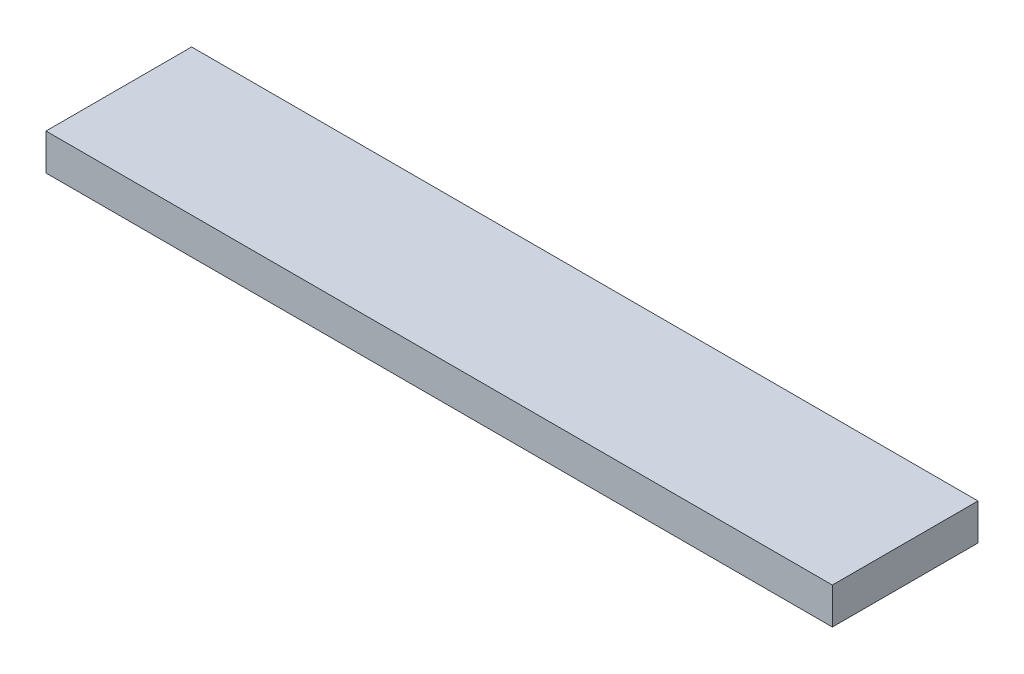
ISO-10303-21;
HEADER;
FILE_DESCRIPTION(('STEP AP214'),'2;1');
FILE_NAME('part.step','',(''),(''),'','','');
FILE_SCHEMA(('AUTOMOTIVE_DESIGN { 1 0 10303 214 1 1 1 1 }'));
ENDSEC;
DATA;
#1=APPLICATION_CONTEXT('core data for automotive mechanical design processes');
#2=APPLICATION_PROTOCOL_DEFINITION('international standard','automotive_design',2000,#1);
#3=PRODUCT_CONTEXT('',#1,'mechanical');
#4=PRODUCT('Part','Part','',(#3));
#5=PRODUCT_RELATED_PRODUCT_CATEGORY('part','',(#4));
#6=PRODUCT_DEFINITION_FORMATION('','',#4);
#7=PRODUCT_DEFINITION_CONTEXT('part definition',#1,'design');
#8=PRODUCT_DEFINITION('design','',#6,#7);
#9=PRODUCT_DEFINITION_SHAPE('','',#8);
#10=(LENGTH_UNIT() NAMED_UNIT(*) SI_UNIT(.MILLI.,.METRE.));
#11=(NAMED_UNIT(*) PLANE_ANGLE_UNIT() SI_UNIT($,.RADIAN.));
#12=(NAMED_UNIT(*) SI_UNIT($,.STERADIAN.) SOLID_ANGLE_UNIT());
#13=UNCERTAINTY_MEASURE_WITH_UNIT(LENGTH_MEASURE(1.E-05),#10,'distance_accuracy_value','');
#14=(GEOMETRIC_REPRESENTATION_CONTEXT(3) GLOBAL_UNCERTAINTY_ASSIGNED_CONTEXT((#13)) GLOBAL_UNIT_ASSIGNED_CONTEXT((#10,
#11,#12)) REPRESENTATION_CONTEXT('',''));
#15=CARTESIAN_POINT('',(0.,0.,0.));
#16=DIRECTION('',(0.,0.,1.));
#17=DIRECTION('',(1.,0.,0.));
#18=AXIS2_PLACEMENT_3D('',#15,#16,#17);
#19=CARTESIAN_POINT('',(0.,3.175,0.));
#20=DIRECTION('',(1.,0.,0.));
#21=DIRECTION('',(0.,0.,-1.));
#22=AXIS2_PLACEMENT_3D('',#19,#20,#21);
#23=PLANE('',#22);
#24=DIRECTION('',(0.,0.,1.));
#25=VECTOR('',#24,1.);
#26=CARTESIAN_POINT('',(0.,0.,0.));
#27=LINE('',#26,#25);
#28=CARTESIAN_POINT('',(0.,0.,-12.7));
#29=VERTEX_POINT('',#28);
#30=CARTESIAN_POINT('',(0.,0.,0.));
#31=VERTEX_POINT('',#30);
#32=EDGE_CURVE('E100',#29,#31,#27,.T.);
#33=ORIENTED_EDGE('',*,*,#32,.T.);
#34=DIRECTION('',(0.,-1.,0.));
#35=VECTOR('',#34,1.);
#36=CARTESIAN_POINT('',(0.,3.175,0.));
#37=LINE('',#36,#35);
#38=CARTESIAN_POINT('',(0.,3.175,0.));
#39=VERTEX_POINT('',#38);
#40=EDGE_CURVE('E11',#39,#31,#37,.T.);
#41=ORIENTED_EDGE('',*,*,#40,.F.);
#42=DIRECTION('',(0.,0.,1.));
#43=VECTOR('',#42,1.);
#44=CARTESIAN_POINT('',(0.,3.175,0.));
#45=LINE('',#44,#43);
#46=CARTESIAN_POINT('',(0.,3.175,-12.7));
#47=VERTEX_POINT('',#46);
#48=EDGE_CURVE('E88',#47,#39,#45,.T.);
#49=ORIENTED_EDGE('',*,*,#48,.F.);
#50=DIRECTION('',(0.,-1.,0.));
#51=VECTOR('',#50,1.);
#52=CARTESIAN_POINT('',(0.,3.175,-12.7));
#53=LINE('',#52,#51);
#54=EDGE_CURVE('E96',#47,#29,#53,.T.);
#55=ORIENTED_EDGE('',*,*,#54,.T.);
#56=EDGE_LOOP('',(#33,#41,#49,#55));
#57=FACE_BOUND('',#56,.T.);
#58=ADVANCED_FACE('F37',(#57),#23,.F.);
#59=CARTESIAN_POINT('',(0.,3.175,0.));
#60=DIRECTION('',(0.,0.,-1.));
#61=DIRECTION('',(-1.,0.,0.));
#62=AXIS2_PLACEMENT_3D('',#59,#60,#61);
#63=PLANE('',#62);
#64=DIRECTION('',(1.,0.,0.));
#65=VECTOR('',#64,1.);
#66=CARTESIAN_POINT('',(0.,0.,0.));
#67=LINE('',#66,#65);
#68=CARTESIAN_POINT('',(68.58,0.,0.));
#69=VERTEX_POINT('',#68);
#70=EDGE_CURVE('E92',#31,#69,#67,.T.);
#71=ORIENTED_EDGE('',*,*,#70,.T.);
#72=DIRECTION('',(0.,-1.,0.));
#73=VECTOR('',#72,1.);
#74=CARTESIAN_POINT('',(68.58,3.175,0.));
#75=LINE('',#74,#73);
#76=CARTESIAN_POINT('',(68.58,3.175,0.));
#77=VERTEX_POINT('',#76);
#78=EDGE_CURVE('E45',#77,#69,#75,.T.);
#79=ORIENTED_EDGE('',*,*,#78,.F.);
#80=DIRECTION('',(1.,0.,0.));
#81=VECTOR('',#80,1.);
#82=CARTESIAN_POINT('',(0.,3.175,0.));
#83=LINE('',#82,#81);
#84=EDGE_CURVE('E83',#39,#77,#83,.T.);
#85=ORIENTED_EDGE('',*,*,#84,.F.);
#86=ORIENTED_EDGE('',*,*,#40,.T.);
#87=EDGE_LOOP('',(#71,#79,#85,#86));
#88=FACE_BOUND('',#87,.T.);
#89=ADVANCED_FACE('F91',(#88),#63,.F.);
#90=CARTESIAN_POINT('',(68.58,3.175,0.));
#91=DIRECTION('',(-1.,0.,0.));
#92=DIRECTION('',(0.,0.,1.));
#93=AXIS2_PLACEMENT_3D('',#90,#91,#92);
#94=PLANE('',#93);
#95=DIRECTION('',(0.,0.,-1.));
#96=VECTOR('',#95,1.);
#97=CARTESIAN_POINT('',(68.58,0.,0.));
#98=LINE('',#97,#96);
#99=CARTESIAN_POINT('',(68.58,0.,-12.7));
#100=VERTEX_POINT('',#99);
#101=EDGE_CURVE('E70',#69,#100,#98,.T.);
#102=ORIENTED_EDGE('',*,*,#101,.T.);
#103=DIRECTION('',(0.,-1.,0.));
#104=VECTOR('',#103,1.);
#105=CARTESIAN_POINT('',(68.58,3.175,-12.7));
#106=LINE('',#105,#104);
#107=CARTESIAN_POINT('',(68.58,3.175,-12.7));
#108=VERTEX_POINT('',#107);
#109=EDGE_CURVE('E93',#108,#100,#106,.T.);
#110=ORIENTED_EDGE('',*,*,#109,.F.);
#111=DIRECTION('',(0.,0.,-1.));
#112=VECTOR('',#111,1.);
#113=CARTESIAN_POINT('',(68.58,3.175,0.));
#114=LINE('',#113,#112);
#115=EDGE_CURVE('E86',#77,#108,#114,.T.);
#116=ORIENTED_EDGE('',*,*,#115,.F.);
#117=ORIENTED_EDGE('',*,*,#78,.T.);
#118=EDGE_LOOP('',(#102,#110,#116,#117));
#119=FACE_BOUND('',#118,.T.);
#120=ADVANCED_FACE('F94',(#119),#94,.F.);
#121=CARTESIAN_POINT('',(0.,3.175,-12.7));
#122=DIRECTION('',(0.,0.,1.));
#123=DIRECTION('',(1.,0.,0.));
#124=AXIS2_PLACEMENT_3D('',#121,#122,#123);
#125=PLANE('',#124);
#126=DIRECTION('',(-1.,0.,0.));
#127=VECTOR('',#126,1.);
#128=CARTESIAN_POINT('',(0.,0.,-12.7));
#129=LINE('',#128,#127);
#130=EDGE_CURVE('E76',#100,#29,#129,.T.);
#131=ORIENTED_EDGE('',*,*,#130,.T.);
#132=ORIENTED_EDGE('',*,*,#54,.F.);
#133=DIRECTION('',(-1.,0.,0.));
#134=VECTOR('',#133,1.);
#135=CARTESIAN_POINT('',(0.,3.175,-12.7));
#136=LINE('',#135,#134);
#137=EDGE_CURVE('E53',#108,#47,#136,.T.);
#138=ORIENTED_EDGE('',*,*,#137,.F.);
#139=ORIENTED_EDGE('',*,*,#109,.T.);
#140=EDGE_LOOP('',(#131,#132,#138,#139));
#141=FACE_BOUND('',#140,.T.);
#142=ADVANCED_FACE('F107',(#141),#125,.F.);
#143=CARTESIAN_POINT('',(0.,3.175,0.));
#144=DIRECTION('',(0.,-1.,0.));
#145=DIRECTION('',(0.,0.,-1.));
#146=AXIS2_PLACEMENT_3D('',#143,#144,#145);
#147=PLANE('',#146);
#148=ORIENTED_EDGE('',*,*,#48,.T.);
#149=ORIENTED_EDGE('',*,*,#84,.T.);
#150=ORIENTED_EDGE('',*,*,#115,.T.);
#151=ORIENTED_EDGE('',*,*,#137,.T.);
#152=EDGE_LOOP('',(#148,#149,#150,#151));
#153=FACE_BOUND('',#152,.T.);
#154=ADVANCED_FACE('F84',(#153),#147,.F.);
#155=CARTESIAN_POINT('',(0.,0.,0.));
#156=DIRECTION('',(0.,-1.,0.));
#157=DIRECTION('',(0.,0.,-1.));
#158=AXIS2_PLACEMENT_3D('',#155,#156,#157);
#159=PLANE('',#158);
#160=ORIENTED_EDGE('',*,*,#32,.F.);
#161=ORIENTED_EDGE('',*,*,#130,.F.);
#162=ORIENTED_EDGE('',*,*,#101,.F.);
#163=ORIENTED_EDGE('',*,*,#70,.F.);
#164=EDGE_LOOP('',(#160,#161,#162,#163));
#165=FACE_BOUND('',#164,.T.);
#166=ADVANCED_FACE('F110',(#165),#159,.T.);
#167=CLOSED_SHELL('',(#58,#89,#120,#142,#154,#166));
#168=MANIFOLD_SOLID_BREP('B2',#167);
#169=ADVANCED_BREP_SHAPE_REPRESENTATION('',(#18,#168),#14);
#170=SHAPE_DEFINITION_REPRESENTATION(#9,#169);
ENDSEC;
END-ISO-10303-21;
